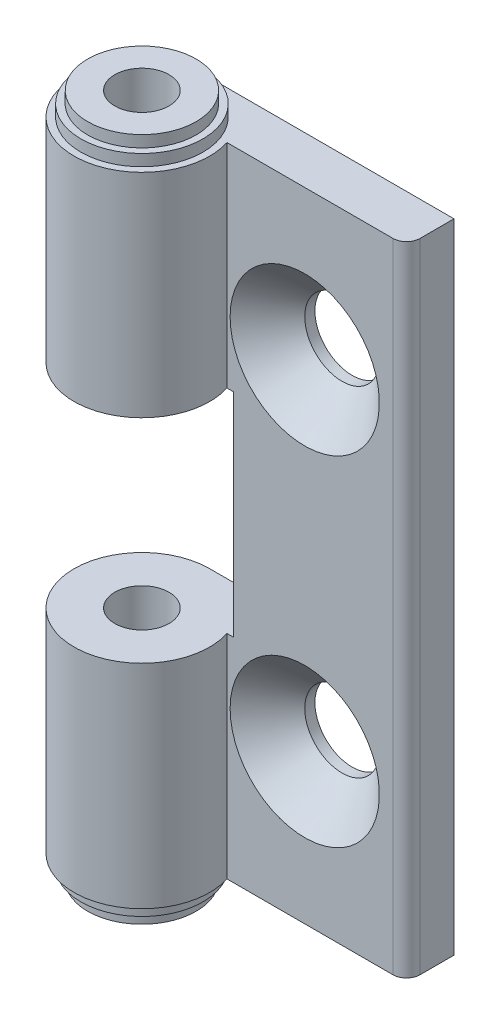
ISO-10303-21;
HEADER;
FILE_DESCRIPTION(('STEP AP214'),'2;1');
FILE_NAME('part.step','',(''),(''),'','','');
FILE_SCHEMA(('AUTOMOTIVE_DESIGN { 1 0 10303 214 1 1 1 1 }'));
ENDSEC;
DATA;
#1=APPLICATION_CONTEXT('core data for automotive mechanical design processes');
#2=APPLICATION_PROTOCOL_DEFINITION('international standard','automotive_design',2000,#1);
#3=PRODUCT_CONTEXT('',#1,'mechanical');
#4=PRODUCT('Part','Part','',(#3));
#5=PRODUCT_RELATED_PRODUCT_CATEGORY('part','',(#4));
#6=PRODUCT_DEFINITION_FORMATION('','',#4);
#7=PRODUCT_DEFINITION_CONTEXT('part definition',#1,'design');
#8=PRODUCT_DEFINITION('design','',#6,#7);
#9=PRODUCT_DEFINITION_SHAPE('','',#8);
#10=(LENGTH_UNIT() NAMED_UNIT(*) SI_UNIT(.MILLI.,.METRE.));
#11=(NAMED_UNIT(*) PLANE_ANGLE_UNIT() SI_UNIT($,.RADIAN.));
#12=(NAMED_UNIT(*) SI_UNIT($,.STERADIAN.) SOLID_ANGLE_UNIT());
#13=UNCERTAINTY_MEASURE_WITH_UNIT(LENGTH_MEASURE(1.E-05),#10,'distance_accuracy_value','');
#14=(GEOMETRIC_REPRESENTATION_CONTEXT(3) GLOBAL_UNCERTAINTY_ASSIGNED_CONTEXT((#13)) GLOBAL_UNIT_ASSIGNED_CONTEXT((#10,
#11,#12)) REPRESENTATION_CONTEXT('',''));
#15=CARTESIAN_POINT('',(0.,0.,0.));
#16=DIRECTION('',(0.,0.,1.));
#17=DIRECTION('',(1.,0.,0.));
#18=AXIS2_PLACEMENT_3D('',#15,#16,#17);
#19=CARTESIAN_POINT('',(0.,23.5,0.));
#20=DIRECTION('',(0.,-1.,0.));
#21=DIRECTION('',(0.,0.,-1.));
#22=AXIS2_PLACEMENT_3D('',#19,#20,#21);
#23=PLANE('',#22);
#24=CARTESIAN_POINT('',(0.,23.5,0.));
#25=DIRECTION('',(0.,-1.,0.));
#26=DIRECTION('',(0.,0.,-1.));
#27=AXIS2_PLACEMENT_3D('',#24,#25,#26);
#28=CIRCLE('',#27,4.5);
#29=CARTESIAN_POINT('',(0.,23.5,-4.5));
#30=VERTEX_POINT('',#29);
#31=EDGE_CURVE('E40',#30,#30,#28,.F.);
#32=ORIENTED_EDGE('',*,*,#31,.F.);
#33=EDGE_LOOP('',(#32));
#34=FACE_BOUND('',#33,.T.);
#35=CARTESIAN_POINT('',(17.0000000000007,23.5,-2.49999999999931));
#36=DIRECTION('',(0.,-1.,0.));
#37=DIRECTION('',(0.,0.,-1.));
#38=AXIS2_PLACEMENT_3D('',#35,#36,#37);
#39=CIRCLE('',#38,0.999999999999304);
#40=CARTESIAN_POINT('',(18.,23.5,-2.5));
#41=VERTEX_POINT('',#40);
#42=CARTESIAN_POINT('',(17.,23.5,-1.5));
#43=VERTEX_POINT('',#42);
#44=EDGE_CURVE('E105',#41,#43,#39,.T.);
#45=ORIENTED_EDGE('',*,*,#44,.F.);
#46=DIRECTION('',(0.,0.,-1.));
#47=VECTOR('',#46,1.);
#48=CARTESIAN_POINT('',(18.,23.5,-1.5));
#49=LINE('',#48,#47);
#50=CARTESIAN_POINT('',(18.,23.5,-5.));
#51=VERTEX_POINT('',#50);
#52=EDGE_CURVE('E130',#41,#51,#49,.T.);
#53=ORIENTED_EDGE('',*,*,#52,.T.);
#54=DIRECTION('',(-1.,0.,0.));
#55=VECTOR('',#54,1.);
#56=CARTESIAN_POINT('',(18.,23.5,-5.));
#57=LINE('',#56,#55);
#58=CARTESIAN_POINT('',(0.,23.5,-5.));
#59=VERTEX_POINT('',#58);
#60=EDGE_CURVE('E128',#51,#59,#57,.T.);
#61=ORIENTED_EDGE('',*,*,#60,.T.);
#62=CARTESIAN_POINT('',(0.,23.5,0.));
#63=DIRECTION('',(0.,1.,0.));
#64=DIRECTION('',(0.,0.,1.));
#65=AXIS2_PLACEMENT_3D('',#62,#63,#64);
#66=CIRCLE('',#65,5.);
#67=CARTESIAN_POINT('',(4.76969600708473,23.5,-1.5));
#68=VERTEX_POINT('',#67);
#69=EDGE_CURVE('E153',#59,#68,#66,.T.);
#70=ORIENTED_EDGE('',*,*,#69,.T.);
#71=DIRECTION('',(-1.,0.,0.));
#72=VECTOR('',#71,1.);
#73=CARTESIAN_POINT('',(18.,23.5,-1.5));
#74=LINE('',#73,#72);
#75=EDGE_CURVE('E127',#43,#68,#74,.T.);
#76=ORIENTED_EDGE('',*,*,#75,.F.);
#77=EDGE_LOOP('',(#45,#53,#61,#70,#76));
#78=FACE_BOUND('',#77,.T.);
#79=ADVANCED_FACE('F32',(#34,#78),#23,.F.);
#80=CARTESIAN_POINT('',(5.,-23.5,0.));
#81=DIRECTION('',(0.,1.,0.));
#82=DIRECTION('',(0.,0.,1.));
#83=AXIS2_PLACEMENT_3D('',#80,#81,#82);
#84=PLANE('',#83);
#85=CARTESIAN_POINT('',(0.,-23.5,0.));
#86=DIRECTION('',(0.,1.,0.));
#87=DIRECTION('',(0.,0.,1.));
#88=AXIS2_PLACEMENT_3D('',#85,#86,#87);
#89=CIRCLE('',#88,4.5);
#90=CARTESIAN_POINT('',(0.,-23.5,4.5));
#91=VERTEX_POINT('',#90);
#92=EDGE_CURVE('E11',#91,#91,#89,.F.);
#93=ORIENTED_EDGE('',*,*,#92,.F.);
#94=EDGE_LOOP('',(#93));
#95=FACE_BOUND('',#94,.T.);
#96=CARTESIAN_POINT('',(17.0000000000007,-23.5,-2.49999999999931));
#97=DIRECTION('',(0.,-1.,0.));
#98=DIRECTION('',(0.,0.,-1.));
#99=AXIS2_PLACEMENT_3D('',#96,#97,#98);
#100=CIRCLE('',#99,0.999999999999304);
#101=CARTESIAN_POINT('',(18.,-23.5,-2.5));
#102=VERTEX_POINT('',#101);
#103=CARTESIAN_POINT('',(17.,-23.5,-1.5));
#104=VERTEX_POINT('',#103);
#105=EDGE_CURVE('E47',#102,#104,#100,.T.);
#106=ORIENTED_EDGE('',*,*,#105,.T.);
#107=DIRECTION('',(1.,0.,0.));
#108=VECTOR('',#107,1.);
#109=CARTESIAN_POINT('',(0.,-23.5,-1.5));
#110=LINE('',#109,#108);
#111=CARTESIAN_POINT('',(4.76969600708473,-23.5,-1.5));
#112=VERTEX_POINT('',#111);
#113=EDGE_CURVE('E117',#112,#104,#110,.T.);
#114=ORIENTED_EDGE('',*,*,#113,.F.);
#115=CARTESIAN_POINT('',(0.,-23.5,0.));
#116=DIRECTION('',(0.,1.,0.));
#117=DIRECTION('',(0.,0.,1.));
#118=AXIS2_PLACEMENT_3D('',#115,#116,#117);
#119=CIRCLE('',#118,5.);
#120=CARTESIAN_POINT('',(0.,-23.5,-5.));
#121=VERTEX_POINT('',#120);
#122=EDGE_CURVE('E151',#121,#112,#119,.T.);
#123=ORIENTED_EDGE('',*,*,#122,.F.);
#124=DIRECTION('',(1.,0.,0.));
#125=VECTOR('',#124,1.);
#126=CARTESIAN_POINT('',(0.,-23.5,-5.));
#127=LINE('',#126,#125);
#128=CARTESIAN_POINT('',(18.,-23.5,-5.));
#129=VERTEX_POINT('',#128);
#130=EDGE_CURVE('E142',#121,#129,#127,.T.);
#131=ORIENTED_EDGE('',*,*,#130,.T.);
#132=DIRECTION('',(0.,0.,-1.));
#133=VECTOR('',#132,1.);
#134=CARTESIAN_POINT('',(18.,-23.5,-1.5));
#135=LINE('',#134,#133);
#136=EDGE_CURVE('E119',#102,#129,#135,.T.);
#137=ORIENTED_EDGE('',*,*,#136,.F.);
#138=EDGE_LOOP('',(#106,#114,#123,#131,#137));
#139=FACE_BOUND('',#138,.T.);
#140=ADVANCED_FACE('F115',(#95,#139),#84,.F.);
#141=CARTESIAN_POINT('',(0.,-23.5,0.));
#142=DIRECTION('',(0.,1.,0.));
#143=DIRECTION('',(0.,0.,1.));
#144=AXIS2_PLACEMENT_3D('',#141,#142,#143);
#145=CYLINDRICAL_SURFACE('',#144,5.);
#146=CARTESIAN_POINT('',(0.,7.8333333333333,0.));
#147=DIRECTION('',(0.,1.,0.));
#148=DIRECTION('',(0.,0.,1.));
#149=AXIS2_PLACEMENT_3D('',#146,#147,#148);
#150=CIRCLE('',#149,5.);
#151=CARTESIAN_POINT('',(0.,7.8333333333333,-5.));
#152=VERTEX_POINT('',#151);
#153=CARTESIAN_POINT('',(4.76969600708473,7.8333333333333,-1.5));
#154=VERTEX_POINT('',#153);
#155=EDGE_CURVE('E186',#152,#154,#150,.T.);
#156=ORIENTED_EDGE('',*,*,#155,.T.);
#157=DIRECTION('',(0.,1.,0.));
#158=VECTOR('',#157,1.);
#159=CARTESIAN_POINT('',(4.76969600708473,-23.5,-1.5));
#160=LINE('',#159,#158);
#161=EDGE_CURVE('E149',#154,#68,#160,.T.);
#162=ORIENTED_EDGE('',*,*,#161,.T.);
#163=ORIENTED_EDGE('',*,*,#69,.F.);
#164=DIRECTION('',(0.,-1.,0.));
#165=VECTOR('',#164,1.);
#166=CARTESIAN_POINT('',(0.,23.5,-5.));
#167=LINE('',#166,#165);
#168=EDGE_CURVE('E139',#59,#152,#167,.T.);
#169=ORIENTED_EDGE('',*,*,#168,.T.);
#170=EDGE_LOOP('',(#156,#162,#163,#169));
#171=FACE_BOUND('',#170,.T.);
#172=ADVANCED_FACE('F185',(#171),#145,.T.);
#173=CARTESIAN_POINT('',(4.76969600708473,-7.8333333333333,-1.5));
#174=VERTEX_POINT('',#173);
#175=EDGE_CURVE('E126',#112,#174,#160,.T.);
#176=ORIENTED_EDGE('',*,*,#175,.T.);
#177=CARTESIAN_POINT('',(0.,-7.8333333333333,0.));
#178=DIRECTION('',(0.,-1.,0.));
#179=DIRECTION('',(0.,0.,-1.));
#180=AXIS2_PLACEMENT_3D('',#177,#178,#179);
#181=CIRCLE('',#180,5.);
#182=CARTESIAN_POINT('',(0.,-7.8333333333333,-5.));
#183=VERTEX_POINT('',#182);
#184=EDGE_CURVE('E197',#174,#183,#181,.T.);
#185=ORIENTED_EDGE('',*,*,#184,.T.);
#186=EDGE_CURVE('E143',#183,#121,#167,.T.);
#187=ORIENTED_EDGE('',*,*,#186,.T.);
#188=ORIENTED_EDGE('',*,*,#122,.T.);
#189=EDGE_LOOP('',(#176,#185,#187,#188));
#190=FACE_BOUND('',#189,.T.);
#191=ADVANCED_FACE('F321',(#190),#145,.T.);
#192=CARTESIAN_POINT('',(0.,0.,-1.5));
#193=DIRECTION('',(0.,0.,1.));
#194=DIRECTION('',(1.,0.,0.));
#195=AXIS2_PLACEMENT_3D('',#192,#193,#194);
#196=PLANE('',#195);
#197=DIRECTION('',(0.,-1.,0.));
#198=VECTOR('',#197,1.);
#199=CARTESIAN_POINT('',(17.,23.5,-1.5));
#200=LINE('',#199,#198);
#201=EDGE_CURVE('E102',#43,#104,#200,.T.);
#202=ORIENTED_EDGE('',*,*,#201,.F.);
#203=ORIENTED_EDGE('',*,*,#75,.T.);
#204=ORIENTED_EDGE('',*,*,#161,.F.);
#205=DIRECTION('',(-1.,0.,0.));
#206=VECTOR('',#205,1.);
#207=CARTESIAN_POINT('',(0.,7.8333333333333,-1.5));
#208=LINE('',#207,#206);
#209=CARTESIAN_POINT('',(5.25,7.8333333333333,-1.5));
#210=VERTEX_POINT('',#209);
#211=EDGE_CURVE('E136',#210,#154,#208,.T.);
#212=ORIENTED_EDGE('',*,*,#211,.F.);
#213=DIRECTION('',(0.,1.,0.));
#214=VECTOR('',#213,1.);
#215=CARTESIAN_POINT('',(5.25,0.,-1.5));
#216=LINE('',#215,#214);
#217=CARTESIAN_POINT('',(5.25,-7.8333333333333,-1.5));
#218=VERTEX_POINT('',#217);
#219=EDGE_CURVE('E190',#218,#210,#216,.T.);
#220=ORIENTED_EDGE('',*,*,#219,.F.);
#221=DIRECTION('',(1.,0.,0.));
#222=VECTOR('',#221,1.);
#223=CARTESIAN_POINT('',(0.,-7.8333333333333,-1.5));
#224=LINE('',#223,#222);
#225=EDGE_CURVE('E193',#174,#218,#224,.T.);
#226=ORIENTED_EDGE('',*,*,#225,.F.);
#227=ORIENTED_EDGE('',*,*,#175,.F.);
#228=ORIENTED_EDGE('',*,*,#113,.T.);
#229=EDGE_LOOP('',(#202,#203,#204,#212,#220,#226,#227,#228));
#230=FACE_BOUND('',#229,.T.);
#231=CARTESIAN_POINT('',(10.5,12.5,-1.5));
#232=DIRECTION('',(0.,0.,-1.));
#233=DIRECTION('',(-1.,0.,0.));
#234=AXIS2_PLACEMENT_3D('',#231,#232,#233);
#235=CIRCLE('',#234,5.5);
#236=CARTESIAN_POINT('',(5.,12.5,-1.5));
#237=VERTEX_POINT('',#236);
#238=EDGE_CURVE('E109',#237,#237,#235,.T.);
#239=ORIENTED_EDGE('',*,*,#238,.T.);
#240=EDGE_LOOP('',(#239));
#241=FACE_BOUND('',#240,.T.);
#242=CARTESIAN_POINT('',(10.5,-12.5,-1.5));
#243=DIRECTION('',(0.,0.,-1.));
#244=DIRECTION('',(-1.,0.,0.));
#245=AXIS2_PLACEMENT_3D('',#242,#243,#244);
#246=CIRCLE('',#245,5.5);
#247=CARTESIAN_POINT('',(5.,-12.5,-1.5));
#248=VERTEX_POINT('',#247);
#249=EDGE_CURVE('E236',#248,#248,#246,.T.);
#250=ORIENTED_EDGE('',*,*,#249,.T.);
#251=EDGE_LOOP('',(#250));
#252=FACE_BOUND('',#251,.T.);
#253=ADVANCED_FACE('F122',(#230,#241,#252),#196,.T.);
#254=CARTESIAN_POINT('',(18.,-23.5,-1.5));
#255=DIRECTION('',(-1.,0.,0.));
#256=DIRECTION('',(0.,0.,1.));
#257=AXIS2_PLACEMENT_3D('',#254,#255,#256);
#258=PLANE('',#257);
#259=ORIENTED_EDGE('',*,*,#52,.F.);
#260=DIRECTION('',(0.,-1.,0.));
#261=VECTOR('',#260,1.);
#262=CARTESIAN_POINT('',(18.,23.5,-2.5));
#263=LINE('',#262,#261);
#264=EDGE_CURVE('E110',#41,#102,#263,.T.);
#265=ORIENTED_EDGE('',*,*,#264,.T.);
#266=ORIENTED_EDGE('',*,*,#136,.T.);
#267=DIRECTION('',(0.,1.,0.));
#268=VECTOR('',#267,1.);
#269=CARTESIAN_POINT('',(18.,-23.5,-5.));
#270=LINE('',#269,#268);
#271=EDGE_CURVE('E133',#129,#51,#270,.T.);
#272=ORIENTED_EDGE('',*,*,#271,.T.);
#273=EDGE_LOOP('',(#259,#265,#266,#272));
#274=FACE_BOUND('',#273,.T.);
#275=ADVANCED_FACE('F175',(#274),#258,.F.);
#276=CARTESIAN_POINT('',(0.,0.,-5.));
#277=DIRECTION('',(0.,0.,1.));
#278=DIRECTION('',(1.,0.,0.));
#279=AXIS2_PLACEMENT_3D('',#276,#277,#278);
#280=PLANE('',#279);
#281=CARTESIAN_POINT('',(10.5,12.5,-5.));
#282=DIRECTION('',(0.,0.,-1.));
#283=DIRECTION('',(-1.,0.,0.));
#284=AXIS2_PLACEMENT_3D('',#281,#282,#283);
#285=CIRCLE('',#284,2.75);
#286=CARTESIAN_POINT('',(7.75,12.5,-5.));
#287=VERTEX_POINT('',#286);
#288=EDGE_CURVE('E239',#287,#287,#285,.T.);
#289=ORIENTED_EDGE('',*,*,#288,.F.);
#290=EDGE_LOOP('',(#289));
#291=FACE_BOUND('',#290,.T.);
#292=CARTESIAN_POINT('',(10.5,-12.5,-5.));
#293=DIRECTION('',(0.,0.,-1.));
#294=DIRECTION('',(-1.,0.,0.));
#295=AXIS2_PLACEMENT_3D('',#292,#293,#294);
#296=CIRCLE('',#295,2.75);
#297=CARTESIAN_POINT('',(7.75,-12.5,-5.));
#298=VERTEX_POINT('',#297);
#299=EDGE_CURVE('E230',#298,#298,#296,.T.);
#300=ORIENTED_EDGE('',*,*,#299,.F.);
#301=EDGE_LOOP('',(#300));
#302=FACE_BOUND('',#301,.T.);
#303=DIRECTION('',(0.,1.,0.));
#304=VECTOR('',#303,1.);
#305=CARTESIAN_POINT('',(5.25,0.,-5.));
#306=LINE('',#305,#304);
#307=CARTESIAN_POINT('',(5.25,-7.8333333333333,-5.));
#308=VERTEX_POINT('',#307);
#309=CARTESIAN_POINT('',(5.25,7.8333333333333,-5.));
#310=VERTEX_POINT('',#309);
#311=EDGE_CURVE('E159',#308,#310,#306,.T.);
#312=ORIENTED_EDGE('',*,*,#311,.T.);
#313=DIRECTION('',(-1.,0.,0.));
#314=VECTOR('',#313,1.);
#315=CARTESIAN_POINT('',(0.,7.8333333333333,-5.));
#316=LINE('',#315,#314);
#317=EDGE_CURVE('E162',#310,#152,#316,.T.);
#318=ORIENTED_EDGE('',*,*,#317,.T.);
#319=ORIENTED_EDGE('',*,*,#168,.F.);
#320=ORIENTED_EDGE('',*,*,#60,.F.);
#321=ORIENTED_EDGE('',*,*,#271,.F.);
#322=ORIENTED_EDGE('',*,*,#130,.F.);
#323=ORIENTED_EDGE('',*,*,#186,.F.);
#324=DIRECTION('',(1.,0.,0.));
#325=VECTOR('',#324,1.);
#326=CARTESIAN_POINT('',(0.,-7.8333333333333,-5.));
#327=LINE('',#326,#325);
#328=EDGE_CURVE('E156',#183,#308,#327,.T.);
#329=ORIENTED_EDGE('',*,*,#328,.T.);
#330=EDGE_LOOP('',(#312,#318,#319,#320,#321,#322,#323,#329));
#331=FACE_BOUND('',#330,.T.);
#332=ADVANCED_FACE('F181',(#291,#302,#331),#280,.F.);
#333=CARTESIAN_POINT('',(-5.,7.8333333333333,47.));
#334=DIRECTION('',(0.,1.,0.));
#335=DIRECTION('',(0.,0.,1.));
#336=AXIS2_PLACEMENT_3D('',#333,#334,#335);
#337=PLANE('',#336);
#338=CARTESIAN_POINT('',(0.,7.8333333333333,0.));
#339=DIRECTION('',(0.,1.,0.));
#340=DIRECTION('',(0.,0.,1.));
#341=AXIS2_PLACEMENT_3D('',#338,#339,#340);
#342=CIRCLE('',#341,2.);
#343=CARTESIAN_POINT('',(0.,7.8333333333333,2.));
#344=VERTEX_POINT('',#343);
#345=EDGE_CURVE('E221',#344,#344,#342,.F.);
#346=ORIENTED_EDGE('',*,*,#345,.F.);
#347=EDGE_LOOP('',(#346));
#348=FACE_BOUND('',#347,.T.);
#349=ORIENTED_EDGE('',*,*,#211,.T.);
#350=ORIENTED_EDGE('',*,*,#155,.F.);
#351=ORIENTED_EDGE('',*,*,#317,.F.);
#352=DIRECTION('',(0.,0.,-1.));
#353=VECTOR('',#352,1.);
#354=CARTESIAN_POINT('',(5.25,7.8333333333333,47.));
#355=LINE('',#354,#353);
#356=EDGE_CURVE('E199',#210,#310,#355,.T.);
#357=ORIENTED_EDGE('',*,*,#356,.F.);
#358=EDGE_LOOP('',(#349,#350,#351,#357));
#359=FACE_BOUND('',#358,.T.);
#360=ADVANCED_FACE('F314',(#348,#359),#337,.F.);
#361=CARTESIAN_POINT('',(5.25,7.8333333333333,47.));
#362=DIRECTION('',(1.,0.,0.));
#363=DIRECTION('',(0.,0.,-1.));
#364=AXIS2_PLACEMENT_3D('',#361,#362,#363);
#365=PLANE('',#364);
#366=ORIENTED_EDGE('',*,*,#219,.T.);
#367=ORIENTED_EDGE('',*,*,#356,.T.);
#368=ORIENTED_EDGE('',*,*,#311,.F.);
#369=DIRECTION('',(0.,0.,-1.));
#370=VECTOR('',#369,1.);
#371=CARTESIAN_POINT('',(5.25,-7.8333333333333,47.));
#372=LINE('',#371,#370);
#373=EDGE_CURVE('E55',#218,#308,#372,.T.);
#374=ORIENTED_EDGE('',*,*,#373,.F.);
#375=EDGE_LOOP('',(#366,#367,#368,#374));
#376=FACE_BOUND('',#375,.T.);
#377=ADVANCED_FACE('F310',(#376),#365,.F.);
#378=CARTESIAN_POINT('',(5.25,-7.8333333333333,47.));
#379=DIRECTION('',(0.,-1.,0.));
#380=DIRECTION('',(0.,0.,-1.));
#381=AXIS2_PLACEMENT_3D('',#378,#379,#380);
#382=PLANE('',#381);
#383=CARTESIAN_POINT('',(0.,-7.8333333333333,0.));
#384=DIRECTION('',(0.,-1.,0.));
#385=DIRECTION('',(0.,0.,-1.));
#386=AXIS2_PLACEMENT_3D('',#383,#384,#385);
#387=CIRCLE('',#386,2.);
#388=CARTESIAN_POINT('',(0.,-7.8333333333333,-2.));
#389=VERTEX_POINT('',#388);
#390=EDGE_CURVE('E224',#389,#389,#387,.F.);
#391=ORIENTED_EDGE('',*,*,#390,.F.);
#392=EDGE_LOOP('',(#391));
#393=FACE_BOUND('',#392,.T.);
#394=ORIENTED_EDGE('',*,*,#225,.T.);
#395=ORIENTED_EDGE('',*,*,#373,.T.);
#396=ORIENTED_EDGE('',*,*,#328,.F.);
#397=ORIENTED_EDGE('',*,*,#184,.F.);
#398=EDGE_LOOP('',(#394,#395,#396,#397));
#399=FACE_BOUND('',#398,.T.);
#400=ADVANCED_FACE('F306',(#393,#399),#382,.F.);
#401=CARTESIAN_POINT('',(0.,25.2,0.));
#402=DIRECTION('',(0.,-1.,0.));
#403=DIRECTION('',(0.,0.,-1.));
#404=AXIS2_PLACEMENT_3D('',#401,#402,#403);
#405=PLANE('',#404);
#406=CARTESIAN_POINT('',(0.,25.2,0.));
#407=DIRECTION('',(0.,-1.,0.));
#408=DIRECTION('',(0.,0.,-1.));
#409=AXIS2_PLACEMENT_3D('',#406,#407,#408);
#410=CIRCLE('',#409,2.);
#411=CARTESIAN_POINT('',(0.,25.2,-2.));
#412=VERTEX_POINT('',#411);
#413=EDGE_CURVE('E227',#412,#412,#410,.F.);
#414=ORIENTED_EDGE('',*,*,#413,.F.);
#415=EDGE_LOOP('',(#414));
#416=FACE_BOUND('',#415,.T.);
#417=CARTESIAN_POINT('',(0.,25.2,0.));
#418=DIRECTION('',(0.,1.,0.));
#419=DIRECTION('',(0.,0.,1.));
#420=AXIS2_PLACEMENT_3D('',#417,#418,#419);
#421=CIRCLE('',#420,4.);
#422=CARTESIAN_POINT('',(0.,25.2,4.));
#423=VERTEX_POINT('',#422);
#424=EDGE_CURVE('E203',#423,#423,#421,.T.);
#425=ORIENTED_EDGE('',*,*,#424,.T.);
#426=EDGE_LOOP('',(#425));
#427=FACE_BOUND('',#426,.T.);
#428=ADVANCED_FACE('F302',(#416,#427),#405,.F.);
#429=CARTESIAN_POINT('',(0.,23.5,0.));
#430=DIRECTION('',(0.,1.,0.));
#431=DIRECTION('',(0.,0.,1.));
#432=AXIS2_PLACEMENT_3D('',#429,#430,#431);
#433=CYLINDRICAL_SURFACE('',#432,4.);
#434=ORIENTED_EDGE('',*,*,#424,.F.);
#435=EDGE_LOOP('',(#434));
#436=FACE_BOUND('',#435,.T.);
#437=CARTESIAN_POINT('',(0.,24.35,0.));
#438=DIRECTION('',(0.,1.,0.));
#439=DIRECTION('',(0.,0.,1.));
#440=AXIS2_PLACEMENT_3D('',#437,#438,#439);
#441=CIRCLE('',#440,4.);
#442=CARTESIAN_POINT('',(0.,24.35,4.));
#443=VERTEX_POINT('',#442);
#444=EDGE_CURVE('E206',#443,#443,#441,.T.);
#445=ORIENTED_EDGE('',*,*,#444,.T.);
#446=EDGE_LOOP('',(#445));
#447=FACE_BOUND('',#446,.T.);
#448=ADVANCED_FACE('F298',(#436,#447),#433,.T.);
#449=CARTESIAN_POINT('',(4.,24.35,0.));
#450=DIRECTION('',(0.,-1.,0.));
#451=DIRECTION('',(0.,0.,-1.));
#452=AXIS2_PLACEMENT_3D('',#449,#450,#451);
#453=PLANE('',#452);
#454=ORIENTED_EDGE('',*,*,#444,.F.);
#455=EDGE_LOOP('',(#454));
#456=FACE_BOUND('',#455,.T.);
#457=CARTESIAN_POINT('',(0.,24.35,0.));
#458=DIRECTION('',(0.,1.,0.));
#459=DIRECTION('',(0.,0.,1.));
#460=AXIS2_PLACEMENT_3D('',#457,#458,#459);
#461=CIRCLE('',#460,4.5);
#462=CARTESIAN_POINT('',(0.,24.35,4.5));
#463=VERTEX_POINT('',#462);
#464=EDGE_CURVE('E209',#463,#463,#461,.T.);
#465=ORIENTED_EDGE('',*,*,#464,.T.);
#466=EDGE_LOOP('',(#465));
#467=FACE_BOUND('',#466,.T.);
#468=ADVANCED_FACE('F294',(#456,#467),#453,.F.);
#469=CARTESIAN_POINT('',(0.,23.5,0.));
#470=DIRECTION('',(0.,1.,0.));
#471=DIRECTION('',(0.,0.,1.));
#472=AXIS2_PLACEMENT_3D('',#469,#470,#471);
#473=CYLINDRICAL_SURFACE('',#472,4.5);
#474=ORIENTED_EDGE('',*,*,#464,.F.);
#475=EDGE_LOOP('',(#474));
#476=FACE_BOUND('',#475,.T.);
#477=ORIENTED_EDGE('',*,*,#31,.T.);
#478=EDGE_LOOP('',(#477));
#479=FACE_BOUND('',#478,.T.);
#480=ADVANCED_FACE('F168',(#476,#479),#473,.T.);
#481=CARTESIAN_POINT('',(0.,-25.2,0.));
#482=DIRECTION('',(0.,1.,0.));
#483=DIRECTION('',(0.,0.,1.));
#484=AXIS2_PLACEMENT_3D('',#481,#482,#483);
#485=CYLINDRICAL_SURFACE('',#484,4.5);
#486=ORIENTED_EDGE('',*,*,#92,.T.);
#487=EDGE_LOOP('',(#486));
#488=FACE_BOUND('',#487,.T.);
#489=CARTESIAN_POINT('',(0.,-24.35,0.));
#490=DIRECTION('',(0.,1.,0.));
#491=DIRECTION('',(0.,0.,1.));
#492=AXIS2_PLACEMENT_3D('',#489,#490,#491);
#493=CIRCLE('',#492,4.5);
#494=CARTESIAN_POINT('',(0.,-24.35,4.5));
#495=VERTEX_POINT('',#494);
#496=EDGE_CURVE('E212',#495,#495,#493,.T.);
#497=ORIENTED_EDGE('',*,*,#496,.T.);
#498=EDGE_LOOP('',(#497));
#499=FACE_BOUND('',#498,.T.);
#500=ADVANCED_FACE('F287',(#488,#499),#485,.T.);
#501=CARTESIAN_POINT('',(4.5,-24.35,0.));
#502=DIRECTION('',(0.,1.,0.));
#503=DIRECTION('',(0.,0.,1.));
#504=AXIS2_PLACEMENT_3D('',#501,#502,#503);
#505=PLANE('',#504);
#506=ORIENTED_EDGE('',*,*,#496,.F.);
#507=EDGE_LOOP('',(#506));
#508=FACE_BOUND('',#507,.T.);
#509=CARTESIAN_POINT('',(0.,-24.35,0.));
#510=DIRECTION('',(0.,1.,0.));
#511=DIRECTION('',(0.,0.,1.));
#512=AXIS2_PLACEMENT_3D('',#509,#510,#511);
#513=CIRCLE('',#512,4.);
#514=CARTESIAN_POINT('',(0.,-24.35,4.));
#515=VERTEX_POINT('',#514);
#516=EDGE_CURVE('E215',#515,#515,#513,.T.);
#517=ORIENTED_EDGE('',*,*,#516,.T.);
#518=EDGE_LOOP('',(#517));
#519=FACE_BOUND('',#518,.T.);
#520=ADVANCED_FACE('F283',(#508,#519),#505,.F.);
#521=CARTESIAN_POINT('',(0.,-25.2,0.));
#522=DIRECTION('',(0.,1.,0.));
#523=DIRECTION('',(0.,0.,1.));
#524=AXIS2_PLACEMENT_3D('',#521,#522,#523);
#525=CYLINDRICAL_SURFACE('',#524,4.);
#526=ORIENTED_EDGE('',*,*,#516,.F.);
#527=EDGE_LOOP('',(#526));
#528=FACE_BOUND('',#527,.T.);
#529=CARTESIAN_POINT('',(0.,-25.2,0.));
#530=DIRECTION('',(0.,1.,0.));
#531=DIRECTION('',(0.,0.,1.));
#532=AXIS2_PLACEMENT_3D('',#529,#530,#531);
#533=CIRCLE('',#532,4.);
#534=CARTESIAN_POINT('',(0.,-25.2,4.));
#535=VERTEX_POINT('',#534);
#536=EDGE_CURVE('E218',#535,#535,#533,.T.);
#537=ORIENTED_EDGE('',*,*,#536,.T.);
#538=EDGE_LOOP('',(#537));
#539=FACE_BOUND('',#538,.T.);
#540=ADVANCED_FACE('F279',(#528,#539),#525,.T.);
#541=CARTESIAN_POINT('',(4.,-25.2,0.));
#542=DIRECTION('',(0.,1.,0.));
#543=DIRECTION('',(0.,0.,1.));
#544=AXIS2_PLACEMENT_3D('',#541,#542,#543);
#545=PLANE('',#544);
#546=CARTESIAN_POINT('',(0.,-25.2,0.));
#547=DIRECTION('',(0.,1.,0.));
#548=DIRECTION('',(0.,0.,1.));
#549=AXIS2_PLACEMENT_3D('',#546,#547,#548);
#550=CIRCLE('',#549,2.);
#551=CARTESIAN_POINT('',(0.,-25.2,2.));
#552=VERTEX_POINT('',#551);
#553=EDGE_CURVE('E35',#552,#552,#550,.F.);
#554=ORIENTED_EDGE('',*,*,#553,.F.);
#555=EDGE_LOOP('',(#554));
#556=FACE_BOUND('',#555,.T.);
#557=ORIENTED_EDGE('',*,*,#536,.F.);
#558=EDGE_LOOP('',(#557));
#559=FACE_BOUND('',#558,.T.);
#560=ADVANCED_FACE('F276',(#556,#559),#545,.F.);
#561=CARTESIAN_POINT('',(0.,-26.7,0.));
#562=DIRECTION('',(0.,1.,0.));
#563=DIRECTION('',(0.,0.,1.));
#564=AXIS2_PLACEMENT_3D('',#561,#562,#563);
#565=CYLINDRICAL_SURFACE('',#564,2.);
#566=ORIENTED_EDGE('',*,*,#553,.T.);
#567=EDGE_LOOP('',(#566));
#568=FACE_BOUND('',#567,.T.);
#569=ORIENTED_EDGE('',*,*,#390,.T.);
#570=EDGE_LOOP('',(#569));
#571=FACE_BOUND('',#570,.T.);
#572=ADVANCED_FACE('F274',(#568,#571),#565,.F.);
#573=ORIENTED_EDGE('',*,*,#413,.T.);
#574=EDGE_LOOP('',(#573));
#575=FACE_BOUND('',#574,.T.);
#576=ORIENTED_EDGE('',*,*,#345,.T.);
#577=EDGE_LOOP('',(#576));
#578=FACE_BOUND('',#577,.T.);
#579=ADVANCED_FACE('F270',(#575,#578),#565,.F.);
#580=CARTESIAN_POINT('',(10.5,-12.5,-1.5));
#581=DIRECTION('',(0.,0.,-1.));
#582=DIRECTION('',(-1.,0.,0.));
#583=AXIS2_PLACEMENT_3D('',#580,#581,#582);
#584=CYLINDRICAL_SURFACE('',#583,2.75);
#585=ORIENTED_EDGE('',*,*,#299,.T.);
#586=EDGE_LOOP('',(#585));
#587=FACE_BOUND('',#586,.T.);
#588=CARTESIAN_POINT('',(10.5,-12.5,-4.25));
#589=DIRECTION('',(0.,0.,-1.));
#590=DIRECTION('',(-1.,0.,0.));
#591=AXIS2_PLACEMENT_3D('',#588,#589,#590);
#592=CIRCLE('',#591,2.75);
#593=CARTESIAN_POINT('',(7.75,-12.5,-4.25));
#594=VERTEX_POINT('',#593);
#595=EDGE_CURVE('E233',#594,#594,#592,.T.);
#596=ORIENTED_EDGE('',*,*,#595,.F.);
#597=EDGE_LOOP('',(#596));
#598=FACE_BOUND('',#597,.T.);
#599=ADVANCED_FACE('F266',(#587,#598),#584,.F.);
#600=CARTESIAN_POINT('',(10.5,-12.5,-1.5));
#601=DIRECTION('',(0.,0.,1.));
#602=DIRECTION('',(1.,0.,0.));
#603=AXIS2_PLACEMENT_3D('',#600,#601,#602);
#604=CONICAL_SURFACE('',#603,5.5,0.785398163397448);
#605=ORIENTED_EDGE('',*,*,#595,.T.);
#606=EDGE_LOOP('',(#605));
#607=FACE_BOUND('',#606,.T.);
#608=ORIENTED_EDGE('',*,*,#249,.F.);
#609=EDGE_LOOP('',(#608));
#610=FACE_BOUND('',#609,.T.);
#611=ADVANCED_FACE('F260',(#607,#610),#604,.F.);
#612=CARTESIAN_POINT('',(10.5,12.5,-1.5));
#613=DIRECTION('',(0.,0.,-1.));
#614=DIRECTION('',(-1.,0.,0.));
#615=AXIS2_PLACEMENT_3D('',#612,#613,#614);
#616=CYLINDRICAL_SURFACE('',#615,2.75);
#617=ORIENTED_EDGE('',*,*,#288,.T.);
#618=EDGE_LOOP('',(#617));
#619=FACE_BOUND('',#618,.T.);
#620=CARTESIAN_POINT('',(10.5,12.5,-4.25));
#621=DIRECTION('',(0.,0.,-1.));
#622=DIRECTION('',(-1.,0.,0.));
#623=AXIS2_PLACEMENT_3D('',#620,#621,#622);
#624=CIRCLE('',#623,2.75);
#625=CARTESIAN_POINT('',(7.75,12.5,-4.25));
#626=VERTEX_POINT('',#625);
#627=EDGE_CURVE('E242',#626,#626,#624,.T.);
#628=ORIENTED_EDGE('',*,*,#627,.F.);
#629=EDGE_LOOP('',(#628));
#630=FACE_BOUND('',#629,.T.);
#631=ADVANCED_FACE('F252',(#619,#630),#616,.F.);
#632=CARTESIAN_POINT('',(10.5,12.5,-1.5));
#633=DIRECTION('',(0.,0.,1.));
#634=DIRECTION('',(1.,0.,0.));
#635=AXIS2_PLACEMENT_3D('',#632,#633,#634);
#636=CONICAL_SURFACE('',#635,5.5,0.785398163397448);
#637=ORIENTED_EDGE('',*,*,#627,.T.);
#638=EDGE_LOOP('',(#637));
#639=FACE_BOUND('',#638,.T.);
#640=ORIENTED_EDGE('',*,*,#238,.F.);
#641=EDGE_LOOP('',(#640));
#642=FACE_BOUND('',#641,.T.);
#643=ADVANCED_FACE('F250',(#639,#642),#636,.F.);
#644=CARTESIAN_POINT('',(17.0000000000007,23.5,-2.49999999999931));
#645=DIRECTION('',(0.,-1.,0.));
#646=DIRECTION('',(0.,0.,-1.));
#647=AXIS2_PLACEMENT_3D('',#644,#645,#646);
#648=CYLINDRICAL_SURFACE('',#647,0.999999999999304);
#649=ORIENTED_EDGE('',*,*,#264,.F.);
#650=ORIENTED_EDGE('',*,*,#44,.T.);
#651=ORIENTED_EDGE('',*,*,#201,.T.);
#652=ORIENTED_EDGE('',*,*,#105,.F.);
#653=EDGE_LOOP('',(#649,#650,#651,#652));
#654=FACE_BOUND('',#653,.T.);
#655=ADVANCED_FACE('F103',(#654),#648,.T.);
#656=CLOSED_SHELL('',(#79,#140,#172,#191,#253,#275,#332,#360,#377,#400,#428,#448,#468,#480,#500,
#520,#540,#560,#572,#579,#599,#611,#631,#643,#655));
#657=MANIFOLD_SOLID_BREP('B2',#656);
#658=ADVANCED_BREP_SHAPE_REPRESENTATION('',(#18,#657),#14);
#659=SHAPE_DEFINITION_REPRESENTATION(#9,#658);
ENDSEC;
END-ISO-10303-21;
